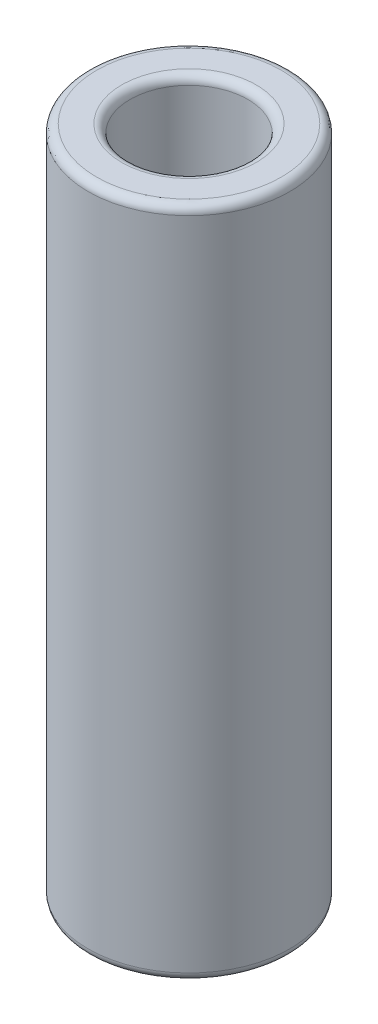
ISO-10303-21;
HEADER;
FILE_DESCRIPTION(('STEP AP214'),'2;1');
FILE_NAME('part.step','',(''),(''),'','','');
FILE_SCHEMA(('AUTOMOTIVE_DESIGN { 1 0 10303 214 1 1 1 1 }'));
ENDSEC;
DATA;
#1=APPLICATION_CONTEXT('core data for automotive mechanical design processes');
#2=APPLICATION_PROTOCOL_DEFINITION('international standard','automotive_design',2000,#1);
#3=PRODUCT_CONTEXT('',#1,'mechanical');
#4=PRODUCT('Part','Part','',(#3));
#5=PRODUCT_RELATED_PRODUCT_CATEGORY('part','',(#4));
#6=PRODUCT_DEFINITION_FORMATION('','',#4);
#7=PRODUCT_DEFINITION_CONTEXT('part definition',#1,'design');
#8=PRODUCT_DEFINITION('design','',#6,#7);
#9=PRODUCT_DEFINITION_SHAPE('','',#8);
#10=(LENGTH_UNIT() NAMED_UNIT(*) SI_UNIT(.MILLI.,.METRE.));
#11=(NAMED_UNIT(*) PLANE_ANGLE_UNIT() SI_UNIT($,.RADIAN.));
#12=(NAMED_UNIT(*) SI_UNIT($,.STERADIAN.) SOLID_ANGLE_UNIT());
#13=UNCERTAINTY_MEASURE_WITH_UNIT(LENGTH_MEASURE(1.E-05),#10,'distance_accuracy_value','');
#14=(GEOMETRIC_REPRESENTATION_CONTEXT(3) GLOBAL_UNCERTAINTY_ASSIGNED_CONTEXT((#13)) GLOBAL_UNIT_ASSIGNED_CONTEXT((#10,
#11,#12)) REPRESENTATION_CONTEXT('',''));
#15=CARTESIAN_POINT('',(0.,0.,0.));
#16=DIRECTION('',(0.,0.,1.));
#17=DIRECTION('',(1.,0.,0.));
#18=AXIS2_PLACEMENT_3D('',#15,#16,#17);
#19=CARTESIAN_POINT('',(0.,40.,0.));
#20=DIRECTION('',(0.,1.,0.));
#21=DIRECTION('',(0.,0.,1.));
#22=AXIS2_PLACEMENT_3D('',#19,#20,#21);
#23=PLANE('',#22);
#24=CARTESIAN_POINT('',(0.,40.,0.));
#25=DIRECTION('',(0.,1.,0.));
#26=DIRECTION('',(0.,0.,1.));
#27=AXIS2_PLACEMENT_3D('',#24,#25,#26);
#28=CIRCLE('',#27,4.);
#29=CARTESIAN_POINT('',(0.,40.,4.));
#30=VERTEX_POINT('',#29);
#31=EDGE_CURVE('E154',#30,#30,#28,.F.);
#32=ORIENTED_EDGE('',*,*,#31,.T.);
#33=EDGE_LOOP('',(#32));
#34=FACE_BOUND('',#33,.T.);
#35=CARTESIAN_POINT('',(0.,40.,0.));
#36=DIRECTION('',(0.,1.,0.));
#37=DIRECTION('',(0.,0.,1.));
#38=AXIS2_PLACEMENT_3D('',#35,#36,#37);
#39=CIRCLE('',#38,5.5);
#40=CARTESIAN_POINT('',(0.,40.,5.5));
#41=VERTEX_POINT('',#40);
#42=EDGE_CURVE('E157',#41,#41,#39,.T.);
#43=ORIENTED_EDGE('',*,*,#42,.T.);
#44=EDGE_LOOP('',(#43));
#45=FACE_BOUND('',#44,.T.);
#46=ADVANCED_FACE('F131',(#34,#45),#23,.T.);
#47=CARTESIAN_POINT('',(0.,0.,0.));
#48=DIRECTION('',(0.,1.,0.));
#49=DIRECTION('',(0.,0.,1.));
#50=AXIS2_PLACEMENT_3D('',#47,#48,#49);
#51=PLANE('',#50);
#52=CARTESIAN_POINT('',(0.,0.,0.));
#53=DIRECTION('',(0.,1.,0.));
#54=DIRECTION('',(0.,0.,1.));
#55=AXIS2_PLACEMENT_3D('',#52,#53,#54);
#56=CIRCLE('',#55,4.);
#57=CARTESIAN_POINT('',(0.,0.,4.));
#58=VERTEX_POINT('',#57);
#59=EDGE_CURVE('E142',#58,#58,#56,.T.);
#60=ORIENTED_EDGE('',*,*,#59,.T.);
#61=EDGE_LOOP('',(#60));
#62=FACE_BOUND('',#61,.T.);
#63=CARTESIAN_POINT('',(0.,0.,0.));
#64=DIRECTION('',(0.,1.,0.));
#65=DIRECTION('',(0.,0.,1.));
#66=AXIS2_PLACEMENT_3D('',#63,#64,#65);
#67=CIRCLE('',#66,5.5);
#68=CARTESIAN_POINT('',(0.,0.,5.5));
#69=VERTEX_POINT('',#68);
#70=EDGE_CURVE('E146',#69,#69,#67,.F.);
#71=ORIENTED_EDGE('',*,*,#70,.T.);
#72=EDGE_LOOP('',(#71));
#73=FACE_BOUND('',#72,.T.);
#74=ADVANCED_FACE('F183',(#62,#73),#51,.F.);
#75=CARTESIAN_POINT('',(0.,40.,0.));
#76=DIRECTION('',(0.,-1.,0.));
#77=DIRECTION('',(0.,0.,-1.));
#78=AXIS2_PLACEMENT_3D('',#75,#76,#77);
#79=CYLINDRICAL_SURFACE('',#78,6.);
#80=CARTESIAN_POINT('',(0.,0.5,0.));
#81=DIRECTION('',(0.,1.,0.));
#82=DIRECTION('',(0.,0.,1.));
#83=AXIS2_PLACEMENT_3D('',#80,#81,#82);
#84=CIRCLE('',#83,6.);
#85=CARTESIAN_POINT('',(0.,0.5,6.));
#86=VERTEX_POINT('',#85);
#87=EDGE_CURVE('E11',#86,#86,#84,.T.);
#88=ORIENTED_EDGE('',*,*,#87,.T.);
#89=EDGE_LOOP('',(#88));
#90=FACE_BOUND('',#89,.T.);
#91=CARTESIAN_POINT('',(0.,39.5,0.));
#92=DIRECTION('',(0.,1.,0.));
#93=DIRECTION('',(0.,0.,1.));
#94=AXIS2_PLACEMENT_3D('',#91,#92,#93);
#95=CIRCLE('',#94,6.);
#96=CARTESIAN_POINT('',(0.,39.5,6.));
#97=VERTEX_POINT('',#96);
#98=EDGE_CURVE('E151',#97,#97,#95,.F.);
#99=ORIENTED_EDGE('',*,*,#98,.T.);
#100=EDGE_LOOP('',(#99));
#101=FACE_BOUND('',#100,.T.);
#102=ADVANCED_FACE('F178',(#90,#101),#79,.T.);
#103=CARTESIAN_POINT('',(0.,40.,0.));
#104=DIRECTION('',(0.,-1.,0.));
#105=DIRECTION('',(0.,0.,-1.));
#106=AXIS2_PLACEMENT_3D('',#103,#104,#105);
#107=CYLINDRICAL_SURFACE('',#106,3.5);
#108=CARTESIAN_POINT('',(0.,0.5,0.));
#109=DIRECTION('',(0.,1.,0.));
#110=DIRECTION('',(0.,0.,1.));
#111=AXIS2_PLACEMENT_3D('',#108,#109,#110);
#112=CIRCLE('',#111,3.5);
#113=CARTESIAN_POINT('',(0.,0.5,3.5));
#114=VERTEX_POINT('',#113);
#115=EDGE_CURVE('E138',#114,#114,#112,.F.);
#116=ORIENTED_EDGE('',*,*,#115,.T.);
#117=EDGE_LOOP('',(#116));
#118=FACE_BOUND('',#117,.T.);
#119=CARTESIAN_POINT('',(0.,39.5,0.));
#120=DIRECTION('',(0.,1.,0.));
#121=DIRECTION('',(0.,0.,1.));
#122=AXIS2_PLACEMENT_3D('',#119,#120,#121);
#123=CIRCLE('',#122,3.5);
#124=CARTESIAN_POINT('',(0.,39.5,3.5));
#125=VERTEX_POINT('',#124);
#126=EDGE_CURVE('E160',#125,#125,#123,.T.);
#127=ORIENTED_EDGE('',*,*,#126,.T.);
#128=EDGE_LOOP('',(#127));
#129=FACE_BOUND('',#128,.T.);
#130=ADVANCED_FACE('F164',(#118,#129),#107,.F.);
#131=CARTESIAN_POINT('',(0.,39.5,0.));
#132=DIRECTION('',(0.,1.,0.));
#133=DIRECTION('',(0.,0.,1.));
#134=AXIS2_PLACEMENT_3D('',#131,#132,#133);
#135=TOROIDAL_SURFACE('',#134,4.,0.5);
#136=ORIENTED_EDGE('',*,*,#31,.F.);
#137=EDGE_LOOP('',(#136));
#138=FACE_BOUND('',#137,.T.);
#139=ORIENTED_EDGE('',*,*,#126,.F.);
#140=EDGE_LOOP('',(#139));
#141=FACE_BOUND('',#140,.T.);
#142=ADVANCED_FACE('F166',(#138,#141),#135,.T.);
#143=CARTESIAN_POINT('',(0.,39.5,0.));
#144=DIRECTION('',(0.,1.,0.));
#145=DIRECTION('',(0.,0.,1.));
#146=AXIS2_PLACEMENT_3D('',#143,#144,#145);
#147=TOROIDAL_SURFACE('',#146,5.5,0.5);
#148=ORIENTED_EDGE('',*,*,#98,.F.);
#149=EDGE_LOOP('',(#148));
#150=FACE_BOUND('',#149,.T.);
#151=ORIENTED_EDGE('',*,*,#42,.F.);
#152=EDGE_LOOP('',(#151));
#153=FACE_BOUND('',#152,.T.);
#154=ADVANCED_FACE('F168',(#150,#153),#147,.T.);
#155=CARTESIAN_POINT('',(0.,0.5,0.));
#156=DIRECTION('',(0.,1.,0.));
#157=DIRECTION('',(0.,0.,1.));
#158=AXIS2_PLACEMENT_3D('',#155,#156,#157);
#159=TOROIDAL_SURFACE('',#158,4.,0.5);
#160=ORIENTED_EDGE('',*,*,#115,.F.);
#161=EDGE_LOOP('',(#160));
#162=FACE_BOUND('',#161,.T.);
#163=ORIENTED_EDGE('',*,*,#59,.F.);
#164=EDGE_LOOP('',(#163));
#165=FACE_BOUND('',#164,.T.);
#166=ADVANCED_FACE('F175',(#162,#165),#159,.T.);
#167=CARTESIAN_POINT('',(0.,0.5,0.));
#168=DIRECTION('',(0.,1.,0.));
#169=DIRECTION('',(0.,0.,1.));
#170=AXIS2_PLACEMENT_3D('',#167,#168,#169);
#171=TOROIDAL_SURFACE('',#170,5.5,0.5);
#172=ORIENTED_EDGE('',*,*,#70,.F.);
#173=EDGE_LOOP('',(#172));
#174=FACE_BOUND('',#173,.T.);
#175=ORIENTED_EDGE('',*,*,#87,.F.);
#176=EDGE_LOOP('',(#175));
#177=FACE_BOUND('',#176,.T.);
#178=ADVANCED_FACE('F133',(#174,#177),#171,.T.);
#179=CLOSED_SHELL('',(#46,#74,#102,#130,#142,#154,#166,#178));
#180=MANIFOLD_SOLID_BREP('B2',#179);
#181=ADVANCED_BREP_SHAPE_REPRESENTATION('',(#18,#180),#14);
#182=SHAPE_DEFINITION_REPRESENTATION(#9,#181);
ENDSEC;
END-ISO-10303-21;
